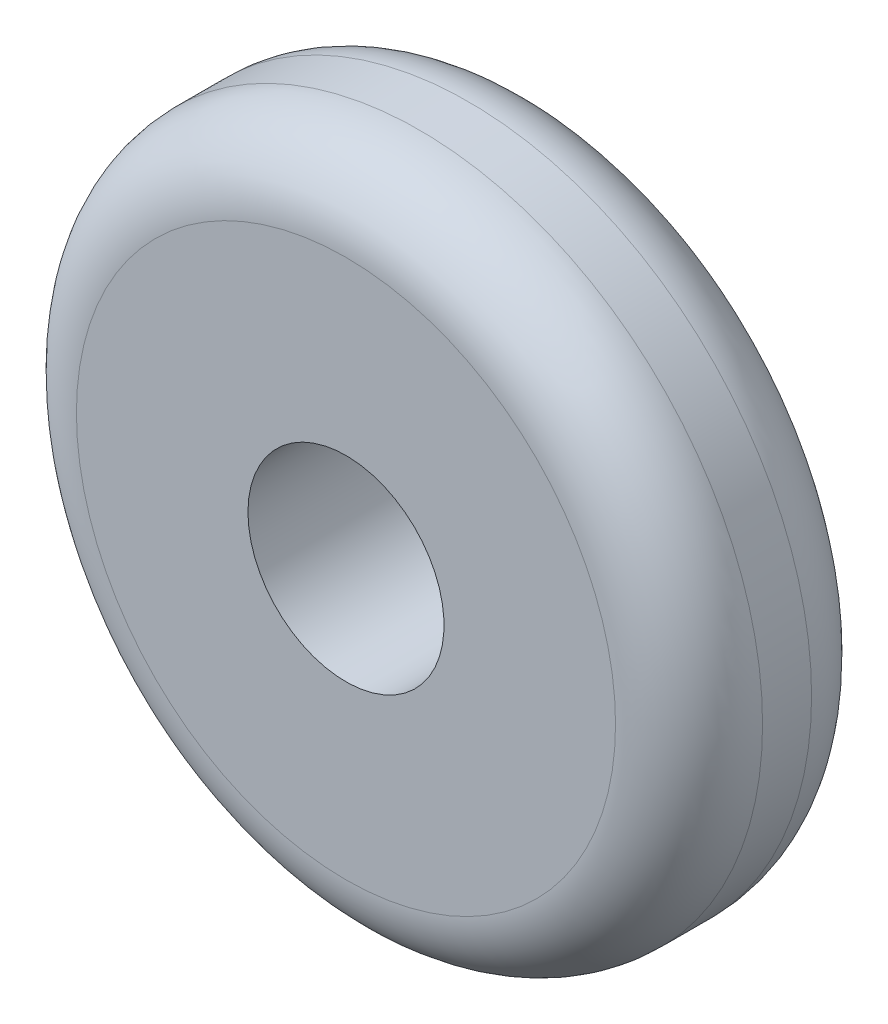
ISO-10303-21;
HEADER;
FILE_DESCRIPTION(('STEP AP214'),'2;1');
FILE_NAME('part.step','',(''),(''),'','','');
FILE_SCHEMA(('AUTOMOTIVE_DESIGN { 1 0 10303 214 1 1 1 1 }'));
ENDSEC;
DATA;
#1=APPLICATION_CONTEXT('core data for automotive mechanical design processes');
#2=APPLICATION_PROTOCOL_DEFINITION('international standard','automotive_design',2000,#1);
#3=PRODUCT_CONTEXT('',#1,'mechanical');
#4=PRODUCT('Part','Part','',(#3));
#5=PRODUCT_RELATED_PRODUCT_CATEGORY('part','',(#4));
#6=PRODUCT_DEFINITION_FORMATION('','',#4);
#7=PRODUCT_DEFINITION_CONTEXT('part definition',#1,'design');
#8=PRODUCT_DEFINITION('design','',#6,#7);
#9=PRODUCT_DEFINITION_SHAPE('','',#8);
#10=(LENGTH_UNIT() NAMED_UNIT(*) SI_UNIT(.MILLI.,.METRE.));
#11=(NAMED_UNIT(*) PLANE_ANGLE_UNIT() SI_UNIT($,.RADIAN.));
#12=(NAMED_UNIT(*) SI_UNIT($,.STERADIAN.) SOLID_ANGLE_UNIT());
#13=UNCERTAINTY_MEASURE_WITH_UNIT(LENGTH_MEASURE(1.E-05),#10,'distance_accuracy_value','');
#14=(GEOMETRIC_REPRESENTATION_CONTEXT(3) GLOBAL_UNCERTAINTY_ASSIGNED_CONTEXT((#13)) GLOBAL_UNIT_ASSIGNED_CONTEXT((#10,
#11,#12)) REPRESENTATION_CONTEXT('',''));
#15=CARTESIAN_POINT('',(0.,0.,0.));
#16=DIRECTION('',(0.,0.,1.));
#17=DIRECTION('',(1.,0.,0.));
#18=AXIS2_PLACEMENT_3D('',#15,#16,#17);
#19=CARTESIAN_POINT('',(3.89416010390613,8.18402251377047,1.5));
#20=DIRECTION('',(0.,0.,1.));
#21=DIRECTION('',(1.,0.,0.));
#22=AXIS2_PLACEMENT_3D('',#19,#20,#21);
#23=TOROIDAL_SURFACE('',#22,5.5,1.5);
#24=CARTESIAN_POINT('',(3.89416010390613,8.18402251377047,0.));
#25=DIRECTION('',(0.,0.,1.));
#26=DIRECTION('',(1.,0.,0.));
#27=AXIS2_PLACEMENT_3D('',#24,#25,#26);
#28=CIRCLE('',#27,5.5);
#29=CARTESIAN_POINT('',(9.39416010390613,8.18402251377047,0.));
#30=VERTEX_POINT('',#29);
#31=CARTESIAN_POINT('',(-1.60583989609387,8.18402251377047,0.));
#32=VERTEX_POINT('',#31);
#33=EDGE_CURVE('E48',#30,#32,#28,.T.);
#34=ORIENTED_EDGE('',*,*,#33,.T.);
#35=CARTESIAN_POINT('',(3.89416010390613,8.18402251377047,0.));
#36=DIRECTION('',(0.,0.,1.));
#37=DIRECTION('',(-1.,0.,0.));
#38=AXIS2_PLACEMENT_3D('',#35,#36,#37);
#39=CIRCLE('',#38,5.5);
#40=EDGE_CURVE('E45',#32,#30,#39,.T.);
#41=ORIENTED_EDGE('',*,*,#40,.T.);
#42=EDGE_LOOP('',(#34,#41));
#43=FACE_BOUND('',#42,.T.);
#44=CARTESIAN_POINT('',(3.89416010390613,8.18402251377047,1.5));
#45=DIRECTION('',(0.,0.,-1.));
#46=DIRECTION('',(-1.,0.,0.));
#47=AXIS2_PLACEMENT_3D('',#44,#45,#46);
#48=CIRCLE('',#47,7.);
#49=CARTESIAN_POINT('',(-3.10583989609387,8.18402251377047,1.5));
#50=VERTEX_POINT('',#49);
#51=EDGE_CURVE('E53',#50,#50,#48,.F.);
#52=ORIENTED_EDGE('',*,*,#51,.F.);
#53=EDGE_LOOP('',(#52));
#54=FACE_BOUND('',#53,.T.);
#55=ADVANCED_FACE('F16',(#43,#54),#23,.T.);
#56=CARTESIAN_POINT('',(3.89416010390613,8.18402251377047,4.));
#57=DIRECTION('',(0.,0.,-1.));
#58=DIRECTION('',(-1.,0.,0.));
#59=AXIS2_PLACEMENT_3D('',#56,#57,#58);
#60=CYLINDRICAL_SURFACE('',#59,7.);
#61=CARTESIAN_POINT('',(3.89416010390613,8.18402251377047,2.5));
#62=DIRECTION('',(0.,0.,1.));
#63=DIRECTION('',(1.,0.,0.));
#64=AXIS2_PLACEMENT_3D('',#61,#62,#63);
#65=CIRCLE('',#64,7.);
#66=CARTESIAN_POINT('',(10.8941601039061,8.18402251377047,2.5));
#67=VERTEX_POINT('',#66);
#68=EDGE_CURVE('E58',#67,#67,#65,.T.);
#69=ORIENTED_EDGE('',*,*,#68,.F.);
#70=EDGE_LOOP('',(#69));
#71=FACE_BOUND('',#70,.T.);
#72=ORIENTED_EDGE('',*,*,#51,.T.);
#73=EDGE_LOOP('',(#72));
#74=FACE_BOUND('',#73,.T.);
#75=ADVANCED_FACE('F76',(#71,#74),#60,.T.);
#76=CARTESIAN_POINT('',(3.89416010390613,8.18402251377047,0.));
#77=DIRECTION('',(0.,0.,1.));
#78=DIRECTION('',(1.,0.,0.));
#79=AXIS2_PLACEMENT_3D('',#76,#77,#78);
#80=PLANE('',#79);
#81=CARTESIAN_POINT('',(3.89416010390613,8.18402251377047,0.));
#82=DIRECTION('',(0.,0.,-1.));
#83=DIRECTION('',(-1.,0.,0.));
#84=AXIS2_PLACEMENT_3D('',#81,#82,#83);
#85=CIRCLE('',#84,2.);
#86=CARTESIAN_POINT('',(1.89416010390613,8.18402251377047,0.));
#87=VERTEX_POINT('',#86);
#88=EDGE_CURVE('E129',#87,#87,#85,.F.);
#89=ORIENTED_EDGE('',*,*,#88,.T.);
#90=EDGE_LOOP('',(#89));
#91=FACE_BOUND('',#90,.T.);
#92=ORIENTED_EDGE('',*,*,#33,.F.);
#93=ORIENTED_EDGE('',*,*,#40,.F.);
#94=EDGE_LOOP('',(#92,#93));
#95=FACE_BOUND('',#94,.T.);
#96=ADVANCED_FACE('F56',(#91,#95),#80,.F.);
#97=CARTESIAN_POINT('',(3.89416010390613,8.18402251377047,2.5));
#98=DIRECTION('',(0.,0.,1.));
#99=DIRECTION('',(1.,0.,0.));
#100=AXIS2_PLACEMENT_3D('',#97,#98,#99);
#101=TOROIDAL_SURFACE('',#100,5.5,1.5);
#102=ORIENTED_EDGE('',*,*,#68,.T.);
#103=EDGE_LOOP('',(#102));
#104=FACE_BOUND('',#103,.T.);
#105=CARTESIAN_POINT('',(3.89416010390613,8.18402251377047,4.));
#106=DIRECTION('',(0.,0.,-1.));
#107=DIRECTION('',(1.,0.,0.));
#108=AXIS2_PLACEMENT_3D('',#105,#106,#107);
#109=CIRCLE('',#108,5.5);
#110=CARTESIAN_POINT('',(-1.60583989609387,8.18402251377047,4.));
#111=VERTEX_POINT('',#110);
#112=CARTESIAN_POINT('',(9.39416010390613,8.18402251377047,4.));
#113=VERTEX_POINT('',#112);
#114=EDGE_CURVE('E29',#111,#113,#109,.F.);
#115=ORIENTED_EDGE('',*,*,#114,.F.);
#116=CARTESIAN_POINT('',(3.89416010390613,8.18402251377047,4.));
#117=DIRECTION('',(0.,0.,-1.));
#118=DIRECTION('',(-1.,0.,0.));
#119=AXIS2_PLACEMENT_3D('',#116,#117,#118);
#120=CIRCLE('',#119,5.5);
#121=EDGE_CURVE('E124',#113,#111,#120,.F.);
#122=ORIENTED_EDGE('',*,*,#121,.F.);
#123=EDGE_LOOP('',(#115,#122));
#124=FACE_BOUND('',#123,.T.);
#125=ADVANCED_FACE('F75',(#104,#124),#101,.T.);
#126=CARTESIAN_POINT('',(3.89416010390613,8.18402251377047,4.));
#127=DIRECTION('',(0.,0.,-1.));
#128=DIRECTION('',(-1.,0.,0.));
#129=AXIS2_PLACEMENT_3D('',#126,#127,#128);
#130=CYLINDRICAL_SURFACE('',#129,2.);
#131=CARTESIAN_POINT('',(3.89416010390613,8.18402251377047,4.));
#132=DIRECTION('',(0.,0.,-1.));
#133=DIRECTION('',(-1.,0.,0.));
#134=AXIS2_PLACEMENT_3D('',#131,#132,#133);
#135=CIRCLE('',#134,2.);
#136=CARTESIAN_POINT('',(1.89416010390613,8.18402251377047,4.));
#137=VERTEX_POINT('',#136);
#138=EDGE_CURVE('E10',#137,#137,#135,.T.);
#139=ORIENTED_EDGE('',*,*,#138,.F.);
#140=EDGE_LOOP('',(#139));
#141=FACE_BOUND('',#140,.T.);
#142=ORIENTED_EDGE('',*,*,#88,.F.);
#143=EDGE_LOOP('',(#142));
#144=FACE_BOUND('',#143,.T.);
#145=ADVANCED_FACE('F92',(#141,#144),#130,.F.);
#146=CARTESIAN_POINT('',(3.89416010390613,8.18402251377047,4.));
#147=DIRECTION('',(0.,0.,1.));
#148=DIRECTION('',(1.,0.,0.));
#149=AXIS2_PLACEMENT_3D('',#146,#147,#148);
#150=PLANE('',#149);
#151=ORIENTED_EDGE('',*,*,#138,.T.);
#152=EDGE_LOOP('',(#151));
#153=FACE_BOUND('',#152,.T.);
#154=ORIENTED_EDGE('',*,*,#121,.T.);
#155=ORIENTED_EDGE('',*,*,#114,.T.);
#156=EDGE_LOOP('',(#154,#155));
#157=FACE_BOUND('',#156,.T.);
#158=ADVANCED_FACE('F90',(#153,#157),#150,.T.);
#159=CLOSED_SHELL('',(#55,#75,#96,#125,#145,#158));
#160=MANIFOLD_SOLID_BREP('B1',#159);
#161=ADVANCED_BREP_SHAPE_REPRESENTATION('',(#18,#160),#14);
#162=SHAPE_DEFINITION_REPRESENTATION(#9,#161);
ENDSEC;
END-ISO-10303-21;
